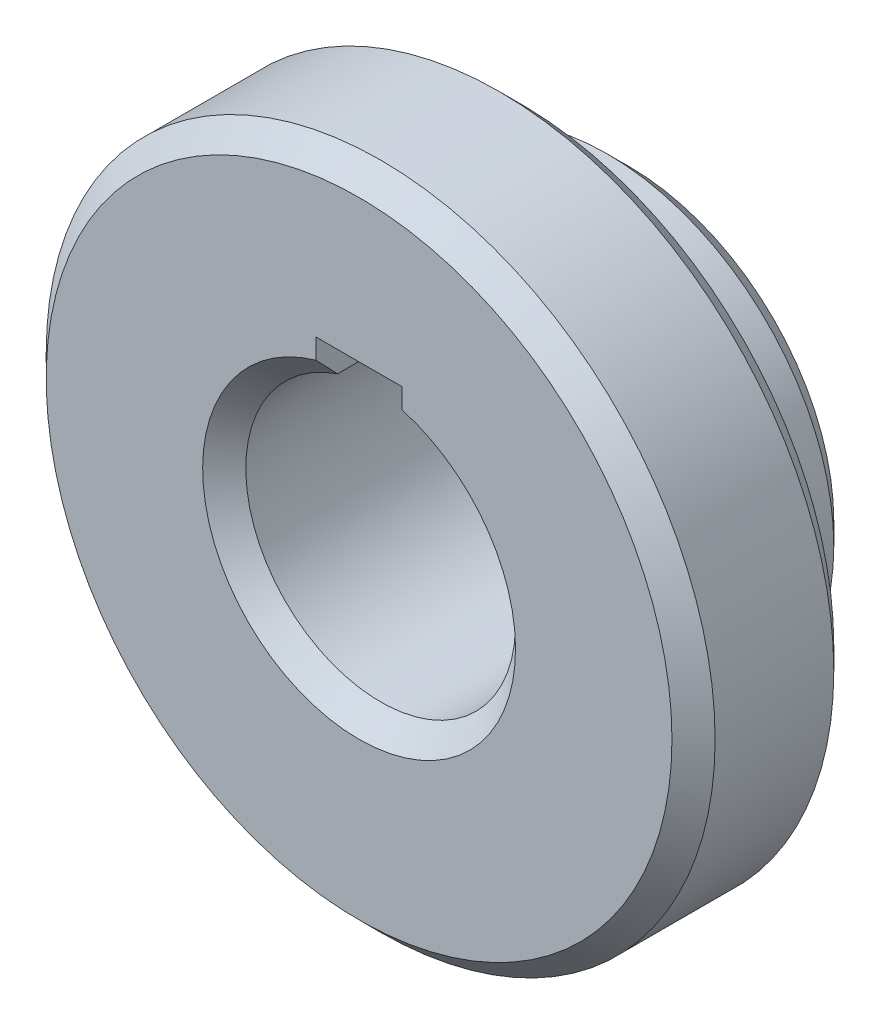
ISO-10303-21;
HEADER;
FILE_DESCRIPTION(('STEP AP214'),'2;1');
FILE_NAME('part.step','',(''),(''),'','','');
FILE_SCHEMA(('AUTOMOTIVE_DESIGN { 1 0 10303 214 1 1 1 1 }'));
ENDSEC;
DATA;
#1=APPLICATION_CONTEXT('core data for automotive mechanical design processes');
#2=APPLICATION_PROTOCOL_DEFINITION('international standard','automotive_design',2000,#1);
#3=PRODUCT_CONTEXT('',#1,'mechanical');
#4=PRODUCT('Part','Part','',(#3));
#5=PRODUCT_RELATED_PRODUCT_CATEGORY('part','',(#4));
#6=PRODUCT_DEFINITION_FORMATION('','',#4);
#7=PRODUCT_DEFINITION_CONTEXT('part definition',#1,'design');
#8=PRODUCT_DEFINITION('design','',#6,#7);
#9=PRODUCT_DEFINITION_SHAPE('','',#8);
#10=(LENGTH_UNIT() NAMED_UNIT(*) SI_UNIT(.MILLI.,.METRE.));
#11=(NAMED_UNIT(*) PLANE_ANGLE_UNIT() SI_UNIT($,.RADIAN.));
#12=(NAMED_UNIT(*) SI_UNIT($,.STERADIAN.) SOLID_ANGLE_UNIT());
#13=UNCERTAINTY_MEASURE_WITH_UNIT(LENGTH_MEASURE(1.E-05),#10,'distance_accuracy_value','');
#14=(GEOMETRIC_REPRESENTATION_CONTEXT(3) GLOBAL_UNCERTAINTY_ASSIGNED_CONTEXT((#13)) GLOBAL_UNIT_ASSIGNED_CONTEXT((#10,
#11,#12)) REPRESENTATION_CONTEXT('',''));
#15=CARTESIAN_POINT('',(0.,0.,0.));
#16=DIRECTION('',(0.,0.,1.));
#17=DIRECTION('',(1.,0.,0.));
#18=AXIS2_PLACEMENT_3D('',#15,#16,#17);
#19=CARTESIAN_POINT('',(0.,0.,-25.));
#20=DIRECTION('',(0.,0.,-1.));
#21=DIRECTION('',(-1.,0.,0.));
#22=AXIS2_PLACEMENT_3D('',#19,#20,#21);
#23=PLANE('',#22);
#24=CARTESIAN_POINT('',(0.,0.,-25.));
#25=DIRECTION('',(0.,0.,-1.));
#26=DIRECTION('',(-1.,0.,0.));
#27=AXIS2_PLACEMENT_3D('',#24,#25,#26);
#28=CIRCLE('',#27,19.);
#29=CARTESIAN_POINT('',(-19.,0.,-25.));
#30=VERTEX_POINT('',#29);
#31=EDGE_CURVE('E186',#30,#30,#28,.T.);
#32=ORIENTED_EDGE('',*,*,#31,.T.);
#33=EDGE_LOOP('',(#32));
#34=FACE_BOUND('',#33,.T.);
#35=DIRECTION('',(0.,-1.,0.));
#36=VECTOR('',#35,1.);
#37=CARTESIAN_POINT('',(-4.,15.8,-25.));
#38=LINE('',#37,#36);
#39=CARTESIAN_POINT('',(-4.,15.8,-25.));
#40=VERTEX_POINT('',#39);
#41=CARTESIAN_POINT('',(-4.,13.9373598647663,-25.));
#42=VERTEX_POINT('',#41);
#43=EDGE_CURVE('E103',#40,#42,#38,.T.);
#44=ORIENTED_EDGE('',*,*,#43,.T.);
#45=CARTESIAN_POINT('',(0.,0.,-25.));
#46=DIRECTION('',(0.,0.,-1.));
#47=DIRECTION('',(-1.,0.,0.));
#48=AXIS2_PLACEMENT_3D('',#45,#46,#47);
#49=CIRCLE('',#48,14.5);
#50=CARTESIAN_POINT('',(4.,13.9373598647663,-25.));
#51=VERTEX_POINT('',#50);
#52=EDGE_CURVE('E99',#42,#51,#49,.F.);
#53=ORIENTED_EDGE('',*,*,#52,.T.);
#54=DIRECTION('',(0.,1.,0.));
#55=VECTOR('',#54,1.);
#56=CARTESIAN_POINT('',(4.,11.842719282327,-25.));
#57=LINE('',#56,#55);
#58=CARTESIAN_POINT('',(4.,15.8,-25.));
#59=VERTEX_POINT('',#58);
#60=EDGE_CURVE('E92',#51,#59,#57,.T.);
#61=ORIENTED_EDGE('',*,*,#60,.T.);
#62=DIRECTION('',(-1.,0.,0.));
#63=VECTOR('',#62,1.);
#64=CARTESIAN_POINT('',(0.,15.8,-25.));
#65=LINE('',#64,#63);
#66=EDGE_CURVE('E98',#59,#40,#65,.T.);
#67=ORIENTED_EDGE('',*,*,#66,.T.);
#68=EDGE_LOOP('',(#44,#53,#61,#67));
#69=FACE_BOUND('',#68,.T.);
#70=ADVANCED_FACE('F45',(#34,#69),#23,.T.);
#71=CARTESIAN_POINT('',(0.,0.,-15.));
#72=DIRECTION('',(0.,0.,1.));
#73=DIRECTION('',(1.,0.,0.));
#74=AXIS2_PLACEMENT_3D('',#71,#72,#73);
#75=CYLINDRICAL_SURFACE('',#74,31.);
#76=CARTESIAN_POINT('',(0.,0.,-13.));
#77=DIRECTION('',(0.,0.,1.));
#78=DIRECTION('',(1.,0.,0.));
#79=AXIS2_PLACEMENT_3D('',#76,#77,#78);
#80=CIRCLE('',#79,31.);
#81=CARTESIAN_POINT('',(31.,0.,-13.));
#82=VERTEX_POINT('',#81);
#83=EDGE_CURVE('E135',#82,#82,#80,.T.);
#84=ORIENTED_EDGE('',*,*,#83,.T.);
#85=EDGE_LOOP('',(#84));
#86=FACE_BOUND('',#85,.T.);
#87=CARTESIAN_POINT('',(0.,0.,-2.00000000000001));
#88=DIRECTION('',(0.,0.,1.));
#89=DIRECTION('',(1.,0.,0.));
#90=AXIS2_PLACEMENT_3D('',#87,#88,#89);
#91=CIRCLE('',#90,31.);
#92=CARTESIAN_POINT('',(31.,0.,-2.00000000000001));
#93=VERTEX_POINT('',#92);
#94=EDGE_CURVE('E124',#93,#93,#91,.F.);
#95=ORIENTED_EDGE('',*,*,#94,.T.);
#96=EDGE_LOOP('',(#95));
#97=FACE_BOUND('',#96,.T.);
#98=ADVANCED_FACE('F208',(#86,#97),#75,.T.);
#99=CARTESIAN_POINT('',(0.,0.,-15.));
#100=DIRECTION('',(0.,0.,1.));
#101=DIRECTION('',(1.,0.,0.));
#102=AXIS2_PLACEMENT_3D('',#99,#100,#101);
#103=PLANE('',#102);
#104=CARTESIAN_POINT('',(0.,0.,-15.));
#105=DIRECTION('',(0.,0.,1.));
#106=DIRECTION('',(1.,0.,0.));
#107=AXIS2_PLACEMENT_3D('',#104,#105,#106);
#108=CIRCLE('',#107,24.);
#109=CARTESIAN_POINT('',(24.,0.,-15.));
#110=VERTEX_POINT('',#109);
#111=EDGE_CURVE('E11',#110,#110,#108,.T.);
#112=ORIENTED_EDGE('',*,*,#111,.T.);
#113=EDGE_LOOP('',(#112));
#114=FACE_BOUND('',#113,.T.);
#115=CARTESIAN_POINT('',(0.,0.,-15.));
#116=DIRECTION('',(0.,0.,1.));
#117=DIRECTION('',(1.,0.,0.));
#118=AXIS2_PLACEMENT_3D('',#115,#116,#117);
#119=CIRCLE('',#118,29.);
#120=CARTESIAN_POINT('',(29.,0.,-15.));
#121=VERTEX_POINT('',#120);
#122=EDGE_CURVE('E134',#121,#121,#119,.F.);
#123=ORIENTED_EDGE('',*,*,#122,.T.);
#124=EDGE_LOOP('',(#123));
#125=FACE_BOUND('',#124,.T.);
#126=ADVANCED_FACE('F212',(#114,#125),#103,.F.);
#127=CARTESIAN_POINT('',(0.,0.,0.));
#128=DIRECTION('',(0.,0.,1.));
#129=DIRECTION('',(1.,0.,0.));
#130=AXIS2_PLACEMENT_3D('',#127,#128,#129);
#131=PLANE('',#130);
#132=CARTESIAN_POINT('',(0.,0.,0.));
#133=DIRECTION('',(0.,0.,1.));
#134=DIRECTION('',(1.,0.,0.));
#135=AXIS2_PLACEMENT_3D('',#132,#133,#134);
#136=CIRCLE('',#135,29.);
#137=CARTESIAN_POINT('',(29.,0.,0.));
#138=VERTEX_POINT('',#137);
#139=EDGE_CURVE('E120',#138,#138,#136,.T.);
#140=ORIENTED_EDGE('',*,*,#139,.T.);
#141=EDGE_LOOP('',(#140));
#142=FACE_BOUND('',#141,.T.);
#143=DIRECTION('',(0.,1.,0.));
#144=VECTOR('',#143,1.);
#145=CARTESIAN_POINT('',(4.,11.842719282327,0.));
#146=LINE('',#145,#144);
#147=CARTESIAN_POINT('',(4.,13.9373598647664,0.));
#148=VERTEX_POINT('',#147);
#149=CARTESIAN_POINT('',(4.,15.8,0.));
#150=VERTEX_POINT('',#149);
#151=EDGE_CURVE('E118',#148,#150,#146,.T.);
#152=ORIENTED_EDGE('',*,*,#151,.F.);
#153=CARTESIAN_POINT('',(0.,0.,0.));
#154=DIRECTION('',(0.,0.,1.));
#155=DIRECTION('',(1.,0.,0.));
#156=AXIS2_PLACEMENT_3D('',#153,#154,#155);
#157=CIRCLE('',#156,14.5);
#158=CARTESIAN_POINT('',(-4.,13.9373598647664,0.));
#159=VERTEX_POINT('',#158);
#160=EDGE_CURVE('E149',#148,#159,#157,.F.);
#161=ORIENTED_EDGE('',*,*,#160,.T.);
#162=DIRECTION('',(0.,-1.,0.));
#163=VECTOR('',#162,1.);
#164=CARTESIAN_POINT('',(-4.,15.8,0.));
#165=LINE('',#164,#163);
#166=CARTESIAN_POINT('',(-4.,15.8,0.));
#167=VERTEX_POINT('',#166);
#168=EDGE_CURVE('E255',#167,#159,#165,.T.);
#169=ORIENTED_EDGE('',*,*,#168,.F.);
#170=DIRECTION('',(-1.,0.,0.));
#171=VECTOR('',#170,1.);
#172=CARTESIAN_POINT('',(0.,15.8,0.));
#173=LINE('',#172,#171);
#174=EDGE_CURVE('E115',#150,#167,#173,.T.);
#175=ORIENTED_EDGE('',*,*,#174,.F.);
#176=EDGE_LOOP('',(#152,#161,#169,#175));
#177=FACE_BOUND('',#176,.T.);
#178=ADVANCED_FACE('F219',(#142,#177),#131,.T.);
#179=CARTESIAN_POINT('',(0.,0.,-25.));
#180=DIRECTION('',(0.,0.,1.));
#181=DIRECTION('',(1.,0.,0.));
#182=AXIS2_PLACEMENT_3D('',#179,#180,#181);
#183=CYLINDRICAL_SURFACE('',#182,21.);
#184=CARTESIAN_POINT('',(0.,0.,-18.));
#185=DIRECTION('',(0.,0.,1.));
#186=DIRECTION('',(1.,0.,0.));
#187=AXIS2_PLACEMENT_3D('',#184,#185,#186);
#188=CIRCLE('',#187,21.);
#189=CARTESIAN_POINT('',(21.,0.,-18.));
#190=VERTEX_POINT('',#189);
#191=EDGE_CURVE('E49',#190,#190,#188,.F.);
#192=ORIENTED_EDGE('',*,*,#191,.T.);
#193=EDGE_LOOP('',(#192));
#194=FACE_BOUND('',#193,.T.);
#195=CARTESIAN_POINT('',(0.,0.,-23.));
#196=DIRECTION('',(0.,0.,-1.));
#197=DIRECTION('',(-1.,0.,0.));
#198=AXIS2_PLACEMENT_3D('',#195,#196,#197);
#199=CIRCLE('',#198,21.);
#200=CARTESIAN_POINT('',(-21.,0.,-23.));
#201=VERTEX_POINT('',#200);
#202=EDGE_CURVE('E194',#201,#201,#199,.F.);
#203=ORIENTED_EDGE('',*,*,#202,.T.);
#204=EDGE_LOOP('',(#203));
#205=FACE_BOUND('',#204,.T.);
#206=ADVANCED_FACE('F198',(#194,#205),#183,.T.);
#207=CARTESIAN_POINT('',(0.,0.,-25.));
#208=DIRECTION('',(0.,0.,1.));
#209=DIRECTION('',(1.,0.,0.));
#210=AXIS2_PLACEMENT_3D('',#207,#208,#209);
#211=CYLINDRICAL_SURFACE('',#210,12.5);
#212=DIRECTION('',(0.,0.,1.));
#213=VECTOR('',#212,1.);
#214=CARTESIAN_POINT('',(4.,11.842719282327,-25.));
#215=LINE('',#214,#213);
#216=CARTESIAN_POINT('',(4.,11.842719282327,-23.));
#217=VERTEX_POINT('',#216);
#218=CARTESIAN_POINT('',(4.,11.842719282327,-2.));
#219=VERTEX_POINT('',#218);
#220=EDGE_CURVE('E116',#217,#219,#215,.T.);
#221=ORIENTED_EDGE('',*,*,#220,.F.);
#222=CARTESIAN_POINT('',(0.,0.,-23.));
#223=DIRECTION('',(0.,0.,-1.));
#224=DIRECTION('',(-1.,0.,0.));
#225=AXIS2_PLACEMENT_3D('',#222,#223,#224);
#226=CIRCLE('',#225,12.5);
#227=CARTESIAN_POINT('',(-4.,11.842719282327,-23.));
#228=VERTEX_POINT('',#227);
#229=EDGE_CURVE('E60',#217,#228,#226,.T.);
#230=ORIENTED_EDGE('',*,*,#229,.T.);
#231=DIRECTION('',(0.,0.,1.));
#232=VECTOR('',#231,1.);
#233=CARTESIAN_POINT('',(-4.,11.842719282327,-25.));
#234=LINE('',#233,#232);
#235=CARTESIAN_POINT('',(-4.,11.842719282327,-2.));
#236=VERTEX_POINT('',#235);
#237=EDGE_CURVE('E125',#228,#236,#234,.T.);
#238=ORIENTED_EDGE('',*,*,#237,.T.);
#239=CARTESIAN_POINT('',(0.,0.,-2.));
#240=DIRECTION('',(0.,0.,1.));
#241=DIRECTION('',(1.,0.,0.));
#242=AXIS2_PLACEMENT_3D('',#239,#240,#241);
#243=CIRCLE('',#242,12.5);
#244=EDGE_CURVE('E140',#236,#219,#243,.T.);
#245=ORIENTED_EDGE('',*,*,#244,.T.);
#246=EDGE_LOOP('',(#221,#230,#238,#245));
#247=FACE_BOUND('',#246,.T.);
#248=ADVANCED_FACE('F217',(#247),#211,.F.);
#249=CARTESIAN_POINT('',(0.,15.8,-25.));
#250=DIRECTION('',(0.,1.,0.));
#251=DIRECTION('',(0.,0.,1.));
#252=AXIS2_PLACEMENT_3D('',#249,#250,#251);
#253=PLANE('',#252);
#254=ORIENTED_EDGE('',*,*,#174,.T.);
#255=DIRECTION('',(0.,0.,1.));
#256=VECTOR('',#255,1.);
#257=CARTESIAN_POINT('',(-4.,15.8,-25.));
#258=LINE('',#257,#256);
#259=EDGE_CURVE('E105',#40,#167,#258,.T.);
#260=ORIENTED_EDGE('',*,*,#259,.F.);
#261=ORIENTED_EDGE('',*,*,#66,.F.);
#262=DIRECTION('',(0.,0.,1.));
#263=VECTOR('',#262,1.);
#264=CARTESIAN_POINT('',(4.,15.8,-25.));
#265=LINE('',#264,#263);
#266=EDGE_CURVE('E108',#59,#150,#265,.T.);
#267=ORIENTED_EDGE('',*,*,#266,.T.);
#268=EDGE_LOOP('',(#254,#260,#261,#267));
#269=FACE_BOUND('',#268,.T.);
#270=ADVANCED_FACE('F107',(#269),#253,.F.);
#271=CARTESIAN_POINT('',(4.,11.842719282327,-25.));
#272=DIRECTION('',(1.,0.,0.));
#273=DIRECTION('',(0.,1.,0.));
#274=AXIS2_PLACEMENT_3D('',#271,#272,#273);
#275=PLANE('',#274);
#276=ORIENTED_EDGE('',*,*,#60,.F.);
#277=CARTESIAN_POINT('',(4.,13.9373598647663,-25.));
#278=CARTESIAN_POINT('',(4.,13.7633605943218,-24.8327537969185));
#279=CARTESIAN_POINT('',(4.,13.5892436018863,-24.665629971065));
#280=CARTESIAN_POINT('',(4.,13.240744413702,-24.3316601998757));
#281=CARTESIAN_POINT('',(4.,13.0663622188083,-24.1648142536474));
#282=CARTESIAN_POINT('',(4.,12.7173016313692,-23.8314321806061));
#283=CARTESIAN_POINT('',(4.,12.5426232386276,-23.6648960539985));
#284=CARTESIAN_POINT('',(4.,12.1929317065842,-23.3321745203293));
#285=CARTESIAN_POINT('',(4.,12.0179185662062,-23.165989114399));
#286=CARTESIAN_POINT('',(4.,11.842719282327,-23.));
#287=B_SPLINE_CURVE_WITH_KNOTS('',3,(#277,#278,#279,#280,#281,#282,#283,#284,#285,#286),
.UNSPECIFIED.,.F.,.F.,(4,2,2,2,4),(0.,0.724032734851061,1.44806313990639,2.17209402454853,
2.89612724097526),.UNSPECIFIED.);
#288=EDGE_CURVE('E64',#51,#217,#287,.T.);
#289=ORIENTED_EDGE('',*,*,#288,.T.);
#290=ORIENTED_EDGE('',*,*,#220,.T.);
#291=CARTESIAN_POINT('',(4.,11.842719282327,-2.));
#292=CARTESIAN_POINT('',(4.,12.0179185662062,-1.83401088560099));
#293=CARTESIAN_POINT('',(4.,12.1929317065842,-1.66782547967074));
#294=CARTESIAN_POINT('',(4.,12.5426232386276,-1.33510394600155));
#295=CARTESIAN_POINT('',(4.,12.7173016313692,-1.16856781939386));
#296=CARTESIAN_POINT('',(4.,13.0663622188083,-0.835185746352604));
#297=CARTESIAN_POINT('',(4.,13.240744413702,-0.668339800124341));
#298=CARTESIAN_POINT('',(4.,13.5892436018863,-0.334370028934994));
#299=CARTESIAN_POINT('',(4.,13.7633605943219,-0.167246203081476));
#300=CARTESIAN_POINT('',(4.,13.9373598647664,0.));
#301=B_SPLINE_CURVE_WITH_KNOTS('',3,(#291,#292,#293,#294,#295,#296,#297,#298,#299,#300),
.UNSPECIFIED.,.F.,.F.,(4,2,2,2,4),(0.,0.724033216426736,1.44806410106888,2.17209450612421,
2.89612724097528),.UNSPECIFIED.);
#302=EDGE_CURVE('E143',#219,#148,#301,.T.);
#303=ORIENTED_EDGE('',*,*,#302,.T.);
#304=ORIENTED_EDGE('',*,*,#151,.T.);
#305=ORIENTED_EDGE('',*,*,#266,.F.);
#306=EDGE_LOOP('',(#276,#289,#290,#303,#304,#305));
#307=FACE_BOUND('',#306,.T.);
#308=ADVANCED_FACE('F111',(#307),#275,.F.);
#309=CARTESIAN_POINT('',(-4.,15.8,-25.));
#310=DIRECTION('',(-1.,0.,0.));
#311=DIRECTION('',(0.,0.,1.));
#312=AXIS2_PLACEMENT_3D('',#309,#310,#311);
#313=PLANE('',#312);
#314=ORIENTED_EDGE('',*,*,#237,.F.);
#315=CARTESIAN_POINT('',(-4.,11.842719282327,-23.));
#316=CARTESIAN_POINT('',(-4.,12.0179185662062,-23.165989114399));
#317=CARTESIAN_POINT('',(-4.,12.1929317065842,-23.3321745203293));
#318=CARTESIAN_POINT('',(-4.,12.5426232386276,-23.6648960539985));
#319=CARTESIAN_POINT('',(-4.,12.7173016313692,-23.8314321806061));
#320=CARTESIAN_POINT('',(-4.,13.0663622188083,-24.1648142536474));
#321=CARTESIAN_POINT('',(-4.,13.240744413702,-24.3316601998757));
#322=CARTESIAN_POINT('',(-4.,13.5892436018863,-24.665629971065));
#323=CARTESIAN_POINT('',(-4.,13.7633605943218,-24.8327537969185));
#324=CARTESIAN_POINT('',(-4.,13.9373598647663,-25.));
#325=B_SPLINE_CURVE_WITH_KNOTS('',3,(#315,#316,#317,#318,#319,#320,#321,#322,#323,#324),
.UNSPECIFIED.,.F.,.F.,(4,2,2,2,4),(0.,0.72403321642673,1.44806410106887,2.1720945061242,
2.89612724097526),.UNSPECIFIED.);
#326=EDGE_CURVE('E185',#228,#42,#325,.T.);
#327=ORIENTED_EDGE('',*,*,#326,.T.);
#328=ORIENTED_EDGE('',*,*,#43,.F.);
#329=ORIENTED_EDGE('',*,*,#259,.T.);
#330=ORIENTED_EDGE('',*,*,#168,.T.);
#331=CARTESIAN_POINT('',(-4.,13.9373598647664,0.));
#332=CARTESIAN_POINT('',(-4.,13.7633605943219,-0.167246203081477));
#333=CARTESIAN_POINT('',(-4.,13.5892436018863,-0.334370028934994));
#334=CARTESIAN_POINT('',(-4.,13.240744413702,-0.668339800124341));
#335=CARTESIAN_POINT('',(-4.,13.0663622188083,-0.835185746352605));
#336=CARTESIAN_POINT('',(-4.,12.7173016313692,-1.16856781939386));
#337=CARTESIAN_POINT('',(-4.,12.5426232386276,-1.33510394600155));
#338=CARTESIAN_POINT('',(-4.,12.1929317065842,-1.66782547967074));
#339=CARTESIAN_POINT('',(-4.,12.0179185662062,-1.834010885601));
#340=CARTESIAN_POINT('',(-4.,11.842719282327,-2.));
#341=B_SPLINE_CURVE_WITH_KNOTS('',3,(#331,#332,#333,#334,#335,#336,#337,#338,#339,#340),
.UNSPECIFIED.,.F.,.F.,(4,2,2,2,4),(0.,0.724032734851062,1.4480631399064,2.17209402454854,
2.89612724097528),.UNSPECIFIED.);
#342=EDGE_CURVE('E259',#159,#236,#341,.T.);
#343=ORIENTED_EDGE('',*,*,#342,.T.);
#344=EDGE_LOOP('',(#314,#327,#328,#329,#330,#343));
#345=FACE_BOUND('',#344,.T.);
#346=ADVANCED_FACE('F159',(#345),#313,.F.);
#347=CARTESIAN_POINT('',(0.,0.,0.));
#348=DIRECTION('',(0.,0.,-1.));
#349=DIRECTION('',(-1.,0.,0.));
#350=AXIS2_PLACEMENT_3D('',#347,#348,#349);
#351=CONICAL_SURFACE('',#350,29.,0.785398163397446);
#352=ORIENTED_EDGE('',*,*,#94,.F.);
#353=EDGE_LOOP('',(#352));
#354=FACE_BOUND('',#353,.T.);
#355=ORIENTED_EDGE('',*,*,#139,.F.);
#356=EDGE_LOOP('',(#355));
#357=FACE_BOUND('',#356,.T.);
#358=ADVANCED_FACE('F226',(#354,#357),#351,.T.);
#359=CARTESIAN_POINT('',(0.,0.,-13.));
#360=DIRECTION('',(0.,0.,1.));
#361=DIRECTION('',(1.,0.,0.));
#362=AXIS2_PLACEMENT_3D('',#359,#360,#361);
#363=CONICAL_SURFACE('',#362,31.,0.785398163397451);
#364=ORIENTED_EDGE('',*,*,#122,.F.);
#365=EDGE_LOOP('',(#364));
#366=FACE_BOUND('',#365,.T.);
#367=ORIENTED_EDGE('',*,*,#83,.F.);
#368=EDGE_LOOP('',(#367));
#369=FACE_BOUND('',#368,.T.);
#370=ADVANCED_FACE('F235',(#366,#369),#363,.T.);
#371=CARTESIAN_POINT('',(0.,0.,-2.));
#372=DIRECTION('',(0.,0.,1.));
#373=DIRECTION('',(1.,0.,0.));
#374=AXIS2_PLACEMENT_3D('',#371,#372,#373);
#375=CONICAL_SURFACE('',#374,12.5,0.785398163397451);
#376=ORIENTED_EDGE('',*,*,#342,.F.);
#377=ORIENTED_EDGE('',*,*,#160,.F.);
#378=ORIENTED_EDGE('',*,*,#302,.F.);
#379=ORIENTED_EDGE('',*,*,#244,.F.);
#380=EDGE_LOOP('',(#376,#377,#378,#379));
#381=FACE_BOUND('',#380,.T.);
#382=ADVANCED_FACE('F155',(#381),#375,.F.);
#383=CARTESIAN_POINT('',(0.,0.,-25.));
#384=DIRECTION('',(0.,0.,-1.));
#385=DIRECTION('',(-1.,0.,0.));
#386=AXIS2_PLACEMENT_3D('',#383,#384,#385);
#387=CONICAL_SURFACE('',#386,14.5,0.785398163397446);
#388=ORIENTED_EDGE('',*,*,#326,.F.);
#389=ORIENTED_EDGE('',*,*,#229,.F.);
#390=ORIENTED_EDGE('',*,*,#288,.F.);
#391=ORIENTED_EDGE('',*,*,#52,.F.);
#392=EDGE_LOOP('',(#388,#389,#390,#391));
#393=FACE_BOUND('',#392,.T.);
#394=ADVANCED_FACE('F171',(#393),#387,.F.);
#395=CARTESIAN_POINT('',(0.,0.,-25.));
#396=DIRECTION('',(0.,0.,1.));
#397=DIRECTION('',(1.,0.,0.));
#398=AXIS2_PLACEMENT_3D('',#395,#396,#397);
#399=CONICAL_SURFACE('',#398,19.,0.785398163397443);
#400=ORIENTED_EDGE('',*,*,#202,.F.);
#401=EDGE_LOOP('',(#400));
#402=FACE_BOUND('',#401,.T.);
#403=ORIENTED_EDGE('',*,*,#31,.F.);
#404=EDGE_LOOP('',(#403));
#405=FACE_BOUND('',#404,.T.);
#406=ADVANCED_FACE('F178',(#402,#405),#399,.T.);
#407=CARTESIAN_POINT('',(0.,0.,-18.));
#408=DIRECTION('',(0.,0.,1.));
#409=DIRECTION('',(1.,0.,0.));
#410=AXIS2_PLACEMENT_3D('',#407,#408,#409);
#411=TOROIDAL_SURFACE('',#410,24.,3.);
#412=ORIENTED_EDGE('',*,*,#111,.F.);
#413=EDGE_LOOP('',(#412));
#414=FACE_BOUND('',#413,.T.);
#415=ORIENTED_EDGE('',*,*,#191,.F.);
#416=EDGE_LOOP('',(#415));
#417=FACE_BOUND('',#416,.T.);
#418=ADVANCED_FACE('F42',(#414,#417),#411,.F.);
#419=CLOSED_SHELL('',(#70,#98,#126,#178,#206,#248,#270,#308,#346,#358,#370,#382,#394,#406,#418));
#420=MANIFOLD_SOLID_BREP('B2',#419);
#421=ADVANCED_BREP_SHAPE_REPRESENTATION('',(#18,#420),#14);
#422=SHAPE_DEFINITION_REPRESENTATION(#9,#421);
ENDSEC;
END-ISO-10303-21;
